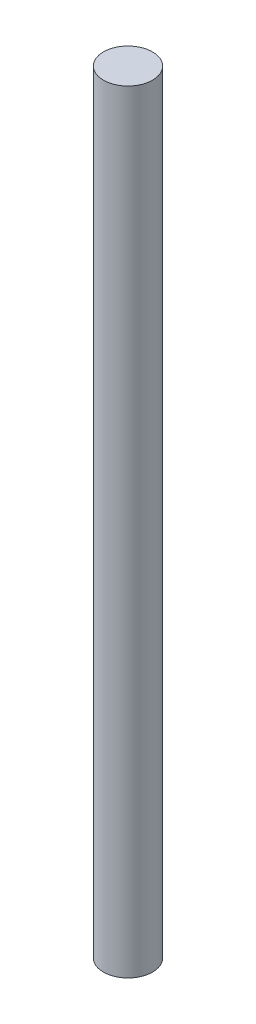
ISO-10303-21;
HEADER;
FILE_DESCRIPTION(('STEP AP214'),'2;1');
FILE_NAME('part.step','',(''),(''),'','','');
FILE_SCHEMA(('AUTOMOTIVE_DESIGN { 1 0 10303 214 1 1 1 1 }'));
ENDSEC;
DATA;
#1=APPLICATION_CONTEXT('core data for automotive mechanical design processes');
#2=APPLICATION_PROTOCOL_DEFINITION('international standard','automotive_design',2000,#1);
#3=PRODUCT_CONTEXT('',#1,'mechanical');
#4=PRODUCT('Part','Part','',(#3));
#5=PRODUCT_RELATED_PRODUCT_CATEGORY('part','',(#4));
#6=PRODUCT_DEFINITION_FORMATION('','',#4);
#7=PRODUCT_DEFINITION_CONTEXT('part definition',#1,'design');
#8=PRODUCT_DEFINITION('design','',#6,#7);
#9=PRODUCT_DEFINITION_SHAPE('','',#8);
#10=(LENGTH_UNIT() NAMED_UNIT(*) SI_UNIT(.MILLI.,.METRE.));
#11=(NAMED_UNIT(*) PLANE_ANGLE_UNIT() SI_UNIT($,.RADIAN.));
#12=(NAMED_UNIT(*) SI_UNIT($,.STERADIAN.) SOLID_ANGLE_UNIT());
#13=UNCERTAINTY_MEASURE_WITH_UNIT(LENGTH_MEASURE(1.E-05),#10,'distance_accuracy_value','');
#14=(GEOMETRIC_REPRESENTATION_CONTEXT(3) GLOBAL_UNCERTAINTY_ASSIGNED_CONTEXT((#13)) GLOBAL_UNIT_ASSIGNED_CONTEXT((#10,
#11,#12)) REPRESENTATION_CONTEXT('',''));
#15=CARTESIAN_POINT('',(0.,0.,0.));
#16=DIRECTION('',(0.,0.,1.));
#17=DIRECTION('',(1.,0.,0.));
#18=AXIS2_PLACEMENT_3D('',#15,#16,#17);
#19=CARTESIAN_POINT('',(0.,100.,0.));
#20=DIRECTION('',(0.,-1.,0.));
#21=DIRECTION('',(0.,0.,-1.));
#22=AXIS2_PLACEMENT_3D('',#19,#20,#21);
#23=CYLINDRICAL_SURFACE('',#22,3.175);
#24=CARTESIAN_POINT('',(0.,100.,0.));
#25=DIRECTION('',(0.,1.,0.));
#26=DIRECTION('',(0.,0.,1.));
#27=AXIS2_PLACEMENT_3D('',#24,#25,#26);
#28=CIRCLE('',#27,3.175);
#29=CARTESIAN_POINT('',(0.,100.,3.175));
#30=VERTEX_POINT('',#29);
#31=EDGE_CURVE('E10',#30,#30,#28,.T.);
#32=ORIENTED_EDGE('',*,*,#31,.F.);
#33=EDGE_LOOP('',(#32));
#34=FACE_BOUND('',#33,.T.);
#35=CARTESIAN_POINT('',(0.,0.,0.));
#36=DIRECTION('',(0.,1.,0.));
#37=DIRECTION('',(0.,0.,1.));
#38=AXIS2_PLACEMENT_3D('',#35,#36,#37);
#39=CIRCLE('',#38,3.175);
#40=CARTESIAN_POINT('',(0.,0.,3.175));
#41=VERTEX_POINT('',#40);
#42=EDGE_CURVE('E34',#41,#41,#39,.T.);
#43=ORIENTED_EDGE('',*,*,#42,.T.);
#44=EDGE_LOOP('',(#43));
#45=FACE_BOUND('',#44,.T.);
#46=ADVANCED_FACE('F31',(#34,#45),#23,.T.);
#47=CARTESIAN_POINT('',(0.,100.,0.));
#48=DIRECTION('',(0.,1.,0.));
#49=DIRECTION('',(0.,0.,1.));
#50=AXIS2_PLACEMENT_3D('',#47,#48,#49);
#51=PLANE('',#50);
#52=ORIENTED_EDGE('',*,*,#31,.T.);
#53=EDGE_LOOP('',(#52));
#54=FACE_BOUND('',#53,.T.);
#55=ADVANCED_FACE('F46',(#54),#51,.T.);
#56=CARTESIAN_POINT('',(0.,0.,0.));
#57=DIRECTION('',(0.,1.,0.));
#58=DIRECTION('',(0.,0.,1.));
#59=AXIS2_PLACEMENT_3D('',#56,#57,#58);
#60=PLANE('',#59);
#61=ORIENTED_EDGE('',*,*,#42,.F.);
#62=EDGE_LOOP('',(#61));
#63=FACE_BOUND('',#62,.T.);
#64=ADVANCED_FACE('F44',(#63),#60,.F.);
#65=CLOSED_SHELL('',(#46,#55,#64));
#66=MANIFOLD_SOLID_BREP('B2',#65);
#67=ADVANCED_BREP_SHAPE_REPRESENTATION('',(#18,#66),#14);
#68=SHAPE_DEFINITION_REPRESENTATION(#9,#67);
ENDSEC;
END-ISO-10303-21;
